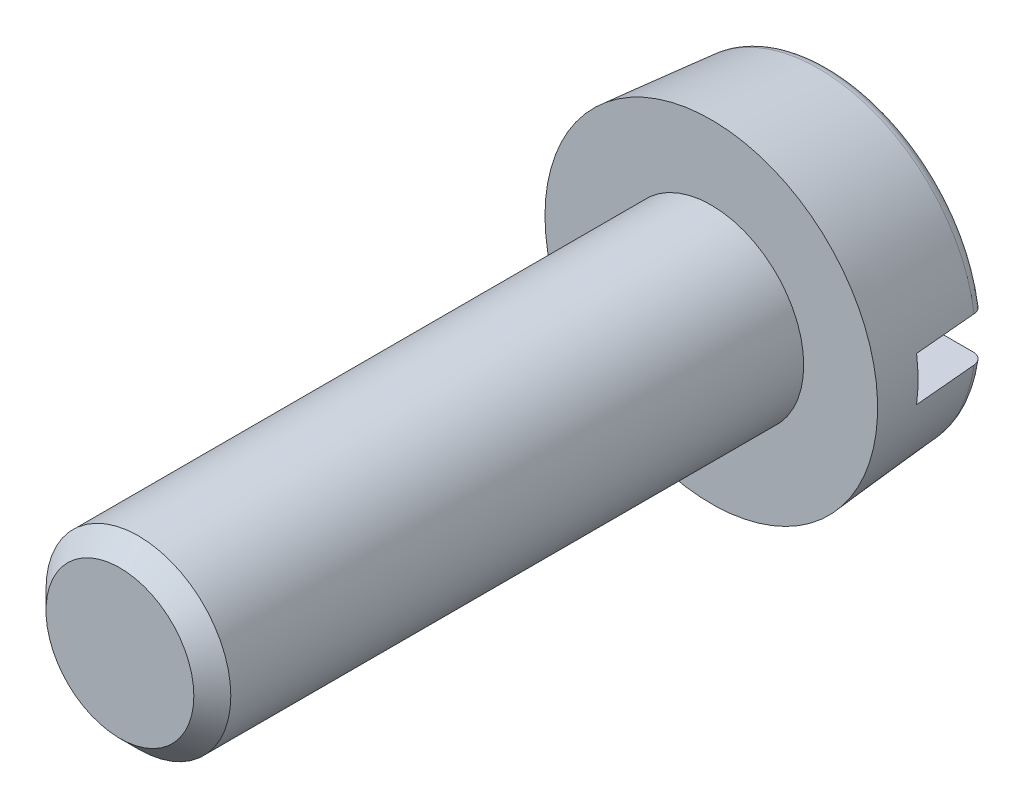
ISO-10303-21;
HEADER;
FILE_DESCRIPTION(('STEP AP214'),'2;1');
FILE_NAME('part.step','',(''),(''),'','','');
FILE_SCHEMA(('AUTOMOTIVE_DESIGN { 1 0 10303 214 1 1 1 1 }'));
ENDSEC;
DATA;
#1=APPLICATION_CONTEXT('core data for automotive mechanical design processes');
#2=APPLICATION_PROTOCOL_DEFINITION('international standard','automotive_design',2000,#1);
#3=PRODUCT_CONTEXT('',#1,'mechanical');
#4=PRODUCT('Part','Part','',(#3));
#5=PRODUCT_RELATED_PRODUCT_CATEGORY('part','',(#4));
#6=PRODUCT_DEFINITION_FORMATION('','',#4);
#7=PRODUCT_DEFINITION_CONTEXT('part definition',#1,'design');
#8=PRODUCT_DEFINITION('design','',#6,#7);
#9=PRODUCT_DEFINITION_SHAPE('','',#8);
#10=(LENGTH_UNIT() NAMED_UNIT(*) SI_UNIT(.MILLI.,.METRE.));
#11=(NAMED_UNIT(*) PLANE_ANGLE_UNIT() SI_UNIT($,.RADIAN.));
#12=(NAMED_UNIT(*) SI_UNIT($,.STERADIAN.) SOLID_ANGLE_UNIT());
#13=UNCERTAINTY_MEASURE_WITH_UNIT(LENGTH_MEASURE(1.E-05),#10,'distance_accuracy_value','');
#14=(GEOMETRIC_REPRESENTATION_CONTEXT(3) GLOBAL_UNCERTAINTY_ASSIGNED_CONTEXT((#13)) GLOBAL_UNIT_ASSIGNED_CONTEXT((#10,
#11,#12)) REPRESENTATION_CONTEXT('',''));
#15=CARTESIAN_POINT('',(0.,0.,0.));
#16=DIRECTION('',(0.,0.,1.));
#17=DIRECTION('',(1.,0.,0.));
#18=AXIS2_PLACEMENT_3D('',#15,#16,#17);
#19=CARTESIAN_POINT('',(0.,0.,-1.59999999999999));
#20=DIRECTION('',(0.,0.,1.));
#21=DIRECTION('',(1.,0.,0.));
#22=AXIS2_PLACEMENT_3D('',#19,#20,#21);
#23=PLANE('',#22);
#24=DIRECTION('',(1.,0.,0.));
#25=VECTOR('',#24,1.);
#26=CARTESIAN_POINT('',(-2.25000000000001,-0.30000000000004,-1.59999999999999));
#27=LINE('',#26,#25);
#28=CARTESIAN_POINT('',(-1.94035042842053,-0.30000000000001,-1.59999999999999));
#29=VERTEX_POINT('',#28);
#30=CARTESIAN_POINT('',(1.94035042842053,-0.300000000000036,-1.59999999999999));
#31=VERTEX_POINT('',#30);
#32=EDGE_CURVE('E206',#29,#31,#27,.T.);
#33=ORIENTED_EDGE('',*,*,#32,.T.);
#34=CARTESIAN_POINT('',(0.,0.,-1.59999999999999));
#35=DIRECTION('',(0.,0.,-1.));
#36=DIRECTION('',(-1.,0.,0.));
#37=AXIS2_PLACEMENT_3D('',#34,#35,#36);
#38=CIRCLE('',#37,1.96340515051573);
#39=EDGE_CURVE('E116',#31,#29,#38,.T.);
#40=ORIENTED_EDGE('',*,*,#39,.T.);
#41=EDGE_LOOP('',(#33,#40));
#42=FACE_BOUND('',#41,.T.);
#43=ADVANCED_FACE('F36',(#42),#23,.F.);
#44=DIRECTION('',(-1.,0.,0.));
#45=VECTOR('',#44,1.);
#46=CARTESIAN_POINT('',(-2.25000000000001,0.299999999999958,-1.59999999999999));
#47=LINE('',#46,#45);
#48=CARTESIAN_POINT('',(1.94035042842053,0.299999999999977,-1.59999999999999));
#49=VERTEX_POINT('',#48);
#50=CARTESIAN_POINT('',(-1.94035042842053,0.299999999999984,-1.59999999999999));
#51=VERTEX_POINT('',#50);
#52=EDGE_CURVE('E101',#49,#51,#47,.T.);
#53=ORIENTED_EDGE('',*,*,#52,.T.);
#54=EDGE_CURVE('E113',#51,#49,#38,.T.);
#55=ORIENTED_EDGE('',*,*,#54,.T.);
#56=EDGE_LOOP('',(#53,#55));
#57=FACE_BOUND('',#56,.T.);
#58=ADVANCED_FACE('F147',(#57),#23,.F.);
#59=CARTESIAN_POINT('',(0.,0.,-1.44));
#60=DIRECTION('',(0.,0.,-1.));
#61=DIRECTION('',(-1.,0.,0.));
#62=AXIS2_PLACEMENT_3D('',#59,#60,#61);
#63=TOROIDAL_SURFACE('',#62,1.96340515051573,0.16);
#64=CARTESIAN_POINT('',(-2.02464929704372,-0.300000000000035,-1.30342454957927));
#65=CARTESIAN_POINT('',(-2.03238938645022,-0.299999999999998,-1.30808813773355));
#66=CARTESIAN_POINT('',(-2.0397302350874,-0.299999999999994,-1.31341159947379));
#67=CARTESIAN_POINT('',(-2.05341968757095,-0.300000000000003,-1.32520564209796));
#68=CARTESIAN_POINT('',(-2.05976863190556,-0.300000000000016,-1.33167582771413));
#69=CARTESIAN_POINT('',(-2.07129025935117,-0.300000000000012,-1.34559915846983));
#70=CARTESIAN_POINT('',(-2.07646208984418,-0.299999999999996,-1.35305300997259));
#71=CARTESIAN_POINT('',(-2.08546893662512,-0.300000000000001,-1.3687256762858));
#72=CARTESIAN_POINT('',(-2.08930440890744,-0.300000000000023,-1.37694422894841));
#73=CARTESIAN_POINT('',(-2.09550224164918,-0.300000000000022,-1.39385316471525));
#74=CARTESIAN_POINT('',(-2.09787484783241,-0.3,-1.40253979183121));
#75=CARTESIAN_POINT('',(-2.10111825783847,-0.299999999999996,-1.42019070905738));
#76=CARTESIAN_POINT('',(-2.10198882599278,-0.300000000000015,-1.42915504251493));
#77=CARTESIAN_POINT('',(-2.10220029511315,-0.300000000000016,-1.44704531451022));
#78=CARTESIAN_POINT('',(-2.10155074064478,-0.3,-1.4559711419653));
#79=CARTESIAN_POINT('',(-2.0987614337047,-0.299999999999997,-1.4735855440648));
#80=CARTESIAN_POINT('',(-2.096621908922,-0.300000000000011,-1.48227415474859));
#81=CARTESIAN_POINT('',(-2.09097610758199,-0.30000000000001,-1.49899459247632));
#82=CARTESIAN_POINT('',(-2.08749896411747,-0.299999999999996,-1.50703627653601));
#83=CARTESIAN_POINT('',(-2.07927587925694,-0.300000000000001,-1.52244264622709));
#84=CARTESIAN_POINT('',(-2.07452984314817,-0.300000000000019,-1.52980728126699));
#85=CARTESIAN_POINT('',(-2.06369301384794,-0.300000000000016,-1.54393623585866));
#86=CARTESIAN_POINT('',(-2.05755692429872,-0.299999999999992,-1.55066585759021));
#87=CARTESIAN_POINT('',(-2.04423921928007,-0.300000000000004,-1.5629961912425));
#88=CARTESIAN_POINT('',(-2.03705748176015,-0.30000000000004,-1.5685967711966));
#89=CARTESIAN_POINT('',(-2.02186128320144,-0.300000000000036,-1.57851380984589));
#90=CARTESIAN_POINT('',(-2.01384719654813,-0.299999999999997,-1.58283084252643));
#91=CARTESIAN_POINT('',(-1.99721237508803,-0.3,-1.59006971709586));
#92=CARTESIAN_POINT('',(-1.98859163746886,-0.300000000000041,-1.59299155251626));
#93=CARTESIAN_POINT('',(-1.97091870079808,-0.300000000000046,-1.5973812130991));
#94=CARTESIAN_POINT('',(-1.96186374376361,-0.300000000000009,-1.59883793441085));
#95=CARTESIAN_POINT('',(-1.9436375590097,-0.299999999999988,-1.60022194772135));
#96=CARTESIAN_POINT('',(-1.93446632582499,-0.300000000000005,-1.60014916756137));
#97=CARTESIAN_POINT('',(-1.91620122580592,-0.300000000000009,-1.598471646742));
#98=CARTESIAN_POINT('',(-1.90710832329842,-0.299999999999997,-1.59685638520298));
#99=CARTESIAN_POINT('',(-1.8893223792299,-0.3,-1.59212246125094));
#100=CARTESIAN_POINT('',(-1.88062934394659,-0.300000000000014,-1.58900377524375));
#101=CARTESIAN_POINT('',(-1.86389238192259,-0.300000000000013,-1.58134698130865));
#102=CARTESIAN_POINT('',(-1.85584844465992,-0.299999999999998,-1.57680889639523));
#103=CARTESIAN_POINT('',(-1.84064450553897,-0.299999999999999,-1.56643653106093));
#104=CARTESIAN_POINT('',(-1.83348447268519,-0.300000000000014,-1.56060229611168));
#105=CARTESIAN_POINT('',(-1.82031484919619,-0.300000000000014,-1.54784998879769));
#106=CARTESIAN_POINT('',(-1.81429660583341,-0.299999999999998,-1.54094085543954));
#107=CARTESIAN_POINT('',(-1.8035234847193,-0.299999999999999,-1.5261990575137));
#108=CARTESIAN_POINT('',(-1.79876852321333,-0.300000000000016,-1.5183664542211));
#109=CARTESIAN_POINT('',(-1.79072202776625,-0.300000000000011,-1.50210751557986));
#110=CARTESIAN_POINT('',(-1.78741252440901,-0.29999999999999,-1.49369007312133));
#111=CARTESIAN_POINT('',(-1.78227224233327,-0.300000000000007,-1.47641541729822));
#112=CARTESIAN_POINT('',(-1.78044132528113,-0.300000000000046,-1.46755824515619));
#113=CARTESIAN_POINT('',(-1.77832801969749,-0.300000000000041,-1.44976395275738));
#114=CARTESIAN_POINT('',(-1.77802818377701,-0.299999999999999,-1.44082890099854));
#115=CARTESIAN_POINT('',(-1.77893920960847,-0.299999999999998,-1.42303579349419));
#116=CARTESIAN_POINT('',(-1.78015011713432,-0.300000000000041,-1.41417774008985));
#117=CARTESIAN_POINT('',(-1.78403768630014,-0.300000000000046,-1.39682461622454));
#118=CARTESIAN_POINT('',(-1.78670884535035,-0.300000000000009,-1.38832831135954));
#119=CARTESIAN_POINT('',(-1.79343111684866,-0.299999999999988,-1.37190233238756));
#120=CARTESIAN_POINT('',(-1.79748202530912,-0.300000000000003,-1.36397257472954));
#121=CARTESIAN_POINT('',(-1.80687028203264,-0.300000000000007,-1.34885198302941));
#122=CARTESIAN_POINT('',(-1.81221491839361,-0.299999999999996,-1.34166567671968));
#123=CARTESIAN_POINT('',(-1.82402289813844,-0.300000000000001,-1.32827601631213));
#124=CARTESIAN_POINT('',(-1.83048664640758,-0.300000000000016,-1.32207301952873));
#125=CARTESIAN_POINT('',(-1.84443082600727,-0.300000000000019,-1.31075125908107));
#126=CARTESIAN_POINT('',(-1.85192245126974,-0.300000000000005,-1.30564629152562));
#127=CARTESIAN_POINT('',(-1.86764748615533,-0.299999999999992,-1.29674140651277));
#128=CARTESIAN_POINT('',(-1.8758811004253,-0.299999999999991,-1.29294185049808));
#129=CARTESIAN_POINT('',(-1.88437618470899,-0.300000000000017,-1.2898595600645));
#130=B_SPLINE_CURVE_WITH_KNOTS('',3,(#64,#65,#66,#67,#68,#69,#70,#71,#72,#73,#74,#75,#76,#77,
#78,#79,#80,#81,#82,#83,#84,#85,#86,#87,#88,#89,#90,#91,#92,#93,#94,#95,#96,#97,#98,#99,#100,
#101,#102,#103,#104,#105,#106,#107,#108,#109,#110,#111,#112,#113,#114,#115,#116,#117,#118,#119,
#120,#121,#122,#123,#124,#125,#126,#127,#128,#129),.UNSPECIFIED.,.F.,.F.,(4,2,2,2,2,2,2,2,2,2,2,
2,2,2,2,2,2,2,2,2,2,2,2,2,2,2,2,2,2,2,2,2,4),(0.,0.0270762320734255,0.0541431492450253,
0.0812296098220387,0.108306818839434,0.135192161848287,0.16208172276172,0.188802902538692,
0.215519999828607,0.241685438135204,0.267852830029475,0.295042618361301,0.32223558289755,
0.349416368746901,0.376597280611857,0.403982673908801,0.431369359194991,0.458944186465299,
0.486519446498425,0.514094259442533,0.5416681051577,0.569023822631126,0.596377725988037,
0.623381161012624,0.650382069355933,0.677074591935086,0.703767923288907,0.730361354042196,
0.756950854822504,0.783693781456511,0.810446403752263,0.837517715120551,0.864596515971967),.UNSPECIFIED.);
#131=CARTESIAN_POINT('',(-2.10149093280898,-0.300000000000021,-1.45394491883963));
#132=VERTEX_POINT('',#131);
#133=EDGE_CURVE('E58',#29,#132,#130,.F.);
#134=ORIENTED_EDGE('',*,*,#133,.F.);
#135=ORIENTED_EDGE('',*,*,#39,.F.);
#136=CARTESIAN_POINT('',(1.87192193792055,-0.30000000000001,-1.29498014059429));
#137=CARTESIAN_POINT('',(1.86365665604565,-0.3,-1.29877602404144));
#138=CARTESIAN_POINT('',(1.85571596083946,-0.3,-1.30327574717215));
#139=CARTESIAN_POINT('',(1.84069618264564,-0.300000000000003,-1.31353396995205));
#140=CARTESIAN_POINT('',(1.83361694392392,-0.300000000000007,-1.319292241553));
#141=CARTESIAN_POINT('',(1.82052442219438,-0.300000000000006,-1.33192491597328));
#142=CARTESIAN_POINT('',(1.81451194952631,-0.300000000000001,-1.33880015974026));
#143=CARTESIAN_POINT('',(1.80374165111526,-0.300000000000002,-1.35346814937426));
#144=CARTESIAN_POINT('',(1.798983340594,-0.300000000000009,-1.361260539042));
#145=CARTESIAN_POINT('',(1.79090415709795,-0.300000000000008,-1.37746698478068));
#146=CARTESIAN_POINT('',(1.78757024385051,-0.3,-1.38587453781138));
#147=CARTESIAN_POINT('',(1.7823790596669,-0.300000000000004,-1.40313569692267));
#148=CARTESIAN_POINT('',(1.78052200113419,-0.300000000000016,-1.41198936696985));
#149=CARTESIAN_POINT('',(1.77835672730874,-0.300000000000015,-1.42978113119124));
#150=CARTESIAN_POINT('',(1.77803106776794,-0.300000000000002,-1.43871710683518));
#151=CARTESIAN_POINT('',(1.77889134237404,-0.300000000000001,-1.45651424290633));
#152=CARTESIAN_POINT('',(1.78007690492273,-0.300000000000012,-1.46537542118642));
#153=CARTESIAN_POINT('',(1.78383153730943,-0.300000000000012,-1.48236382370257));
#154=CARTESIAN_POINT('',(1.78633336881265,-0.300000000000002,-1.4905059956366));
#155=CARTESIAN_POINT('',(1.79260574839287,-0.300000000000001,-1.50628621956971));
#156=CARTESIAN_POINT('',(1.79637639273958,-0.300000000000011,-1.51392423326374));
#157=CARTESIAN_POINT('',(1.80537845098725,-0.300000000000013,-1.52899645668504));
#158=CARTESIAN_POINT('',(1.81069121243361,-0.300000000000003,-1.53638220540862));
#159=CARTESIAN_POINT('',(1.82248536704283,-0.3,-1.5501537958638));
#160=CARTESIAN_POINT('',(1.82896700490272,-0.300000000000007,-1.55653942770313));
#161=CARTESIAN_POINT('',(1.8429031272916,-0.300000000000007,-1.56813246773482));
#162=CARTESIAN_POINT('',(1.85035705242775,-0.299999999999999,-1.57334054874203));
#163=CARTESIAN_POINT('',(1.86602656164542,-0.300000000000004,-1.58244449256944));
#164=CARTESIAN_POINT('',(1.87424213923321,-0.300000000000017,-1.58634036657602));
#165=CARTESIAN_POINT('',(1.89128158778596,-0.300000000000017,-1.59274689308417));
#166=CARTESIAN_POINT('',(1.90011028149796,-0.300000000000003,-1.5952447201112));
#167=CARTESIAN_POINT('',(1.91806064636874,-0.3,-1.59873418389206));
#168=CARTESIAN_POINT('',(1.92718233185473,-0.300000000000011,-1.59972574687522));
#169=CARTESIAN_POINT('',(1.94552672883593,-0.300000000000006,-1.6001767837559));
#170=CARTESIAN_POINT('',(1.95474970336984,-0.299999999999991,-1.59962565417901));
#171=CARTESIAN_POINT('',(1.97297214216613,-0.300000000000012,-1.59698142324873));
#172=CARTESIAN_POINT('',(1.9819716048057,-0.300000000000047,-1.59488831070309));
#173=CARTESIAN_POINT('',(1.99948027791315,-0.300000000000046,-1.58921751799395));
#174=CARTESIAN_POINT('',(2.00798997382085,-0.300000000000009,-1.58564133769318));
#175=CARTESIAN_POINT('',(2.0242816895916,-0.299999999999994,-1.57710047964158));
#176=CARTESIAN_POINT('',(2.03206373577954,-0.300000000000017,-1.5721358521479));
#177=CARTESIAN_POINT('',(2.04661460760603,-0.300000000000021,-1.56099760750979));
#178=CARTESIAN_POINT('',(2.05339068144285,-0.300000000000004,-1.55483346144383));
#179=CARTESIAN_POINT('',(2.06579832392635,-0.299999999999999,-1.54144428767823));
#180=CARTESIAN_POINT('',(2.07142994974375,-0.300000000000011,-1.53421931300321));
#181=CARTESIAN_POINT('',(2.0813263647335,-0.300000000000013,-1.51899455168457));
#182=CARTESIAN_POINT('',(2.08560480767252,-0.300000000000003,-1.51100363992621));
#183=CARTESIAN_POINT('',(2.0927451860902,-0.300000000000001,-1.49441238566327));
#184=CARTESIAN_POINT('',(2.09560722902235,-0.30000000000001,-1.48581208944551));
#185=CARTESIAN_POINT('',(2.09980866249617,-0.300000000000011,-1.46832999311366));
#186=CARTESIAN_POINT('',(2.10116162704749,-0.300000000000003,-1.45945145344438));
#187=CARTESIAN_POINT('',(2.10235053172659,-0.300000000000001,-1.44159288478053));
#188=CARTESIAN_POINT('',(2.10218642032958,-0.300000000000007,-1.43261285234928));
#189=CARTESIAN_POINT('',(2.10035002783136,-0.300000000000006,-1.41484821667873));
#190=CARTESIAN_POINT('',(2.09868432983211,-0.299999999999999,-1.4060629317366));
#191=CARTESIAN_POINT('',(2.09390423755724,-0.300000000000005,-1.388897570698));
#192=CARTESIAN_POINT('',(2.09079009655452,-0.300000000000019,-1.38051742404225));
#193=CARTESIAN_POINT('',(2.08319941144264,-0.300000000000019,-1.36438297790799));
#194=CARTESIAN_POINT('',(2.07872073313043,-0.300000000000003,-1.35662968306703));
#195=CARTESIAN_POINT('',(2.06853281671289,-0.3,-1.34197537615141));
#196=CARTESIAN_POINT('',(2.06282317677678,-0.300000000000012,-1.33507464354404));
#197=CARTESIAN_POINT('',(2.05029523353403,-0.300000000000015,-1.3222742793196));
#198=CARTESIAN_POINT('',(2.04346966339441,-0.300000000000006,-1.31638176571566));
#199=CARTESIAN_POINT('',(2.0289356043396,-0.299999999999997,-1.30580450648123));
#200=CARTESIAN_POINT('',(2.02122679141315,-0.299999999999997,-1.30112020613704));
#201=CARTESIAN_POINT('',(2.0131779179159,-0.300000000000016,-1.29711681792469));
#202=B_SPLINE_CURVE_WITH_KNOTS('',3,(#136,#137,#138,#139,#140,#141,#142,#143,#144,#145,#146,
#147,#148,#149,#150,#151,#152,#153,#154,#155,#156,#157,#158,#159,#160,#161,#162,#163,#164,#165,
#166,#167,#168,#169,#170,#171,#172,#173,#174,#175,#176,#177,#178,#179,#180,#181,#182,#183,#184,
#185,#186,#187,#188,#189,#190,#191,#192,#193,#194,#195,#196,#197,#198,#199,#200,#201),
.UNSPECIFIED.,.F.,.F.,(4,2,2,2,2,2,2,2,2,2,2,2,2,2,2,2,2,2,2,2,2,2,2,2,2,2,2,2,2,2,2,2,4),(0.,
0.0272527077159249,0.0545004813450557,0.0817688652032895,0.109026693352196,0.136029333022942,
0.163035855552001,0.189733987811275,0.216425556465628,0.241869861435967,0.267316097398819,
0.294477965657911,0.321645526700594,0.348797525619947,0.375949293066701,0.403346227007337,
0.430744502694846,0.458331557979555,0.48591881350266,0.513478237134255,0.54103666333552,
0.568385731314877,0.595733432739531,0.622795672250161,0.649855858401689,0.676670627098275,
0.703486306514209,0.730184992077352,0.756879010896381,0.783614996679391,0.81035972331419,
0.83728610491247,0.864222396078811),.UNSPECIFIED.);
#203=CARTESIAN_POINT('',(2.10149093280895,-0.300000000000016,-1.45394491883963));
#204=VERTEX_POINT('',#203);
#205=EDGE_CURVE('E134',#204,#31,#202,.F.);
#206=ORIENTED_EDGE('',*,*,#205,.F.);
#207=CARTESIAN_POINT('',(0.,0.,-1.45394491883963));
#208=DIRECTION('',(0.,0.,-1.));
#209=DIRECTION('',(-1.,0.,0.));
#210=AXIS2_PLACEMENT_3D('',#207,#208,#209);
#211=CIRCLE('',#210,2.12279630221041);
#212=EDGE_CURVE('E125',#204,#132,#211,.T.);
#213=ORIENTED_EDGE('',*,*,#212,.T.);
#214=EDGE_LOOP('',(#134,#135,#206,#213));
#215=FACE_BOUND('',#214,.T.);
#216=ADVANCED_FACE('F142',(#215),#63,.T.);
#217=CARTESIAN_POINT('',(-2.02464929704371,0.299999999999962,-1.30342454957927));
#218=CARTESIAN_POINT('',(-2.03238938645021,0.300000000000003,-1.30808813773355));
#219=CARTESIAN_POINT('',(-2.03973023508739,0.30000000000001,-1.31341159947379));
#220=CARTESIAN_POINT('',(-2.05341968757094,0.300000000000004,-1.32520564209796));
#221=CARTESIAN_POINT('',(-2.05976863190555,0.299999999999991,-1.33167582771413));
#222=CARTESIAN_POINT('',(-2.07129025935116,0.299999999999995,-1.34559915846984));
#223=CARTESIAN_POINT('',(-2.07646208984416,0.300000000000011,-1.3530530099726));
#224=CARTESIAN_POINT('',(-2.08546893662512,0.300000000000003,-1.36872567628581));
#225=CARTESIAN_POINT('',(-2.08930440890744,0.299999999999978,-1.37694422894841));
#226=CARTESIAN_POINT('',(-2.09550224164918,0.29999999999998,-1.39385316471525));
#227=CARTESIAN_POINT('',(-2.0978748478324,0.300000000000006,-1.40253979183121));
#228=CARTESIAN_POINT('',(-2.10111825783846,0.300000000000007,-1.42019070905739));
#229=CARTESIAN_POINT('',(-2.10198882599278,0.299999999999983,-1.42915504251493));
#230=CARTESIAN_POINT('',(-2.10220029511314,0.299999999999982,-1.44704531451022));
#231=CARTESIAN_POINT('',(-2.10155074064477,0.300000000000006,-1.45597114196529));
#232=CARTESIAN_POINT('',(-2.09876143370469,0.300000000000008,-1.4735855440648));
#233=CARTESIAN_POINT('',(-2.096621908922,0.299999999999987,-1.4822741547486));
#234=CARTESIAN_POINT('',(-2.09097610758198,0.299999999999986,-1.49899459247632));
#235=CARTESIAN_POINT('',(-2.08749896411746,0.300000000000005,-1.507036276536));
#236=CARTESIAN_POINT('',(-2.07927587925693,0.300000000000008,-1.52244264622709));
#237=CARTESIAN_POINT('',(-2.07452984314816,0.299999999999992,-1.52980728126699));
#238=CARTESIAN_POINT('',(-2.06369301384793,0.299999999999994,-1.54393623585867));
#239=CARTESIAN_POINT('',(-2.0575569242987,0.300000000000014,-1.55066585759021));
#240=CARTESIAN_POINT('',(-2.04423921928006,0.3,-1.5629961912425));
#241=CARTESIAN_POINT('',(-2.03705748176014,0.299999999999966,-1.5685967711966));
#242=CARTESIAN_POINT('',(-2.02186128320143,0.299999999999971,-1.57851380984589));
#243=CARTESIAN_POINT('',(-2.01384719654812,0.300000000000009,-1.58283084252643));
#244=CARTESIAN_POINT('',(-1.99721237508802,0.300000000000004,-1.59006971709586));
#245=CARTESIAN_POINT('',(-1.98859163746885,0.299999999999962,-1.59299155251626));
#246=CARTESIAN_POINT('',(-1.97091870079807,0.299999999999958,-1.5973812130991));
#247=CARTESIAN_POINT('',(-1.96186374376361,0.299999999999998,-1.59883793441085));
#248=CARTESIAN_POINT('',(-1.9436375590097,0.300000000000016,-1.60022194772135));
#249=CARTESIAN_POINT('',(-1.93446632582499,0.299999999999994,-1.60014916756136));
#250=CARTESIAN_POINT('',(-1.91620122580592,0.299999999999988,-1.598471646742));
#251=CARTESIAN_POINT('',(-1.90710832329842,0.300000000000004,-1.59685638520299));
#252=CARTESIAN_POINT('',(-1.8893223792299,0.300000000000009,-1.59212246125094));
#253=CARTESIAN_POINT('',(-1.8806293439466,0.299999999999998,-1.58900377524372));
#254=CARTESIAN_POINT('',(-1.86389238192259,0.299999999999998,-1.58134698130862));
#255=CARTESIAN_POINT('',(-1.85584844465991,0.300000000000008,-1.57680889639522));
#256=CARTESIAN_POINT('',(-1.84064450553895,0.300000000000005,-1.56643653106094));
#257=CARTESIAN_POINT('',(-1.83348447268519,0.29999999999999,-1.56060229611168));
#258=CARTESIAN_POINT('',(-1.82031484919619,0.299999999999992,-1.54784998879769));
#259=CARTESIAN_POINT('',(-1.81429660583339,0.300000000000009,-1.54094085543955));
#260=CARTESIAN_POINT('',(-1.80352348471929,0.300000000000004,-1.5261990575137));
#261=CARTESIAN_POINT('',(-1.79876852321333,0.299999999999984,-1.5183664542211));
#262=CARTESIAN_POINT('',(-1.79072202776624,0.299999999999988,-1.50210751557986));
#263=CARTESIAN_POINT('',(-1.787412524409,0.300000000000013,-1.49369007312134));
#264=CARTESIAN_POINT('',(-1.78227224233326,0.3,-1.47641541729822));
#265=CARTESIAN_POINT('',(-1.78044132528113,0.299999999999963,-1.46755824515619));
#266=CARTESIAN_POINT('',(-1.77832801969749,0.299999999999967,-1.44976395275738));
#267=CARTESIAN_POINT('',(-1.778028183777,0.300000000000008,-1.44082890099853));
#268=CARTESIAN_POINT('',(-1.77893920960845,0.300000000000005,-1.42303579349419));
#269=CARTESIAN_POINT('',(-1.78015011713431,0.299999999999962,-1.41417774008985));
#270=CARTESIAN_POINT('',(-1.78403768630013,0.299999999999959,-1.39682461622454));
#271=CARTESIAN_POINT('',(-1.78670884535034,0.299999999999999,-1.38832831135953));
#272=CARTESIAN_POINT('',(-1.79343111684865,0.300000000000014,-1.37190233238756));
#273=CARTESIAN_POINT('',(-1.79748202530912,0.29999999999999,-1.36397257472954));
#274=CARTESIAN_POINT('',(-1.80687028203265,0.299999999999986,-1.34885198302941));
#275=CARTESIAN_POINT('',(-1.81221491839361,0.300000000000006,-1.34166567671967));
#276=CARTESIAN_POINT('',(-1.82402289813843,0.300000000000007,-1.32827601631212));
#277=CARTESIAN_POINT('',(-1.83048664640758,0.299999999999987,-1.32207301952873));
#278=CARTESIAN_POINT('',(-1.84443082600727,0.299999999999982,-1.31075125908107));
#279=CARTESIAN_POINT('',(-1.85192245126974,0.299999999999998,-1.30564629152562));
#280=CARTESIAN_POINT('',(-1.86764748615532,0.300000000000015,-1.29674140651276));
#281=CARTESIAN_POINT('',(-1.8758811004253,0.300000000000016,-1.29294185049808));
#282=CARTESIAN_POINT('',(-1.884376184709,0.299999999999983,-1.2898595600645));
#283=B_SPLINE_CURVE_WITH_KNOTS('',3,(#217,#218,#219,#220,#221,#222,#223,#224,#225,#226,#227,
#228,#229,#230,#231,#232,#233,#234,#235,#236,#237,#238,#239,#240,#241,#242,#243,#244,#245,#246,
#247,#248,#249,#250,#251,#252,#253,#254,#255,#256,#257,#258,#259,#260,#261,#262,#263,#264,#265,
#266,#267,#268,#269,#270,#271,#272,#273,#274,#275,#276,#277,#278,#279,#280,#281,#282),
.UNSPECIFIED.,.F.,.F.,(4,2,2,2,2,2,2,2,2,2,2,2,2,2,2,2,2,2,2,2,2,2,2,2,2,2,2,2,2,2,2,2,4),(0.,
0.0270762320734237,0.0541431492450244,0.0812296098220406,0.108306818839437,0.135192161848288,
0.162081722761721,0.188802902538692,0.215519999828607,0.241685438135204,0.267852830029477,
0.295042618361305,0.322235582897553,0.349416368746901,0.376597280611858,0.403982673908797,
0.43136935919498,0.458944186465292,0.486519446498427,0.514094259442532,0.541668105157692,
0.569023822631118,0.596377725988031,0.623381161012618,0.650382069355927,0.677074591935081,
0.703767923288903,0.730361354042194,0.756950854822506,0.783693781456512,0.810446403752262,
0.837517715120551,0.864596515971971),.UNSPECIFIED.);
#284=CARTESIAN_POINT('',(-2.10149093280895,0.299999999999989,-1.45394491883963));
#285=VERTEX_POINT('',#284);
#286=EDGE_CURVE('E159',#285,#51,#283,.T.);
#287=ORIENTED_EDGE('',*,*,#286,.F.);
#288=CARTESIAN_POINT('',(2.10149093280898,0.299999999999986,-1.45394491883963));
#289=VERTEX_POINT('',#288);
#290=EDGE_CURVE('E121',#285,#289,#211,.T.);
#291=ORIENTED_EDGE('',*,*,#290,.T.);
#292=CARTESIAN_POINT('',(1.87192193792055,0.299999999999981,-1.29498014059429));
#293=CARTESIAN_POINT('',(1.86365665604564,0.300000000000006,-1.29877602404143));
#294=CARTESIAN_POINT('',(1.85571596083945,0.300000000000007,-1.30327574717214));
#295=CARTESIAN_POINT('',(1.84069618264564,0.299999999999999,-1.31353396995204));
#296=CARTESIAN_POINT('',(1.83361694392393,0.299999999999989,-1.319292241553));
#297=CARTESIAN_POINT('',(1.82052442219438,0.299999999999993,-1.33192491597328));
#298=CARTESIAN_POINT('',(1.8145119495263,0.300000000000007,-1.33880015974025));
#299=CARTESIAN_POINT('',(1.80374165111525,0.3,-1.35346814937425));
#300=CARTESIAN_POINT('',(1.798983340594,0.29999999999998,-1.361260539042));
#301=CARTESIAN_POINT('',(1.79090415709795,0.299999999999981,-1.37746698478068));
#302=CARTESIAN_POINT('',(1.7875702438505,0.300000000000002,-1.38587453781137));
#303=CARTESIAN_POINT('',(1.78237905966689,0.300000000000005,-1.40313569692267));
#304=CARTESIAN_POINT('',(1.78052200113419,0.299999999999986,-1.41198936696985));
#305=CARTESIAN_POINT('',(1.77835672730874,0.299999999999986,-1.42978113119124));
#306=CARTESIAN_POINT('',(1.77803106776792,0.300000000000003,-1.43871710683517));
#307=CARTESIAN_POINT('',(1.77889134237403,0.300000000000004,-1.45651424290631));
#308=CARTESIAN_POINT('',(1.78007690492273,0.299999999999986,-1.46537542118639));
#309=CARTESIAN_POINT('',(1.78383153730943,0.299999999999986,-1.48236382370254));
#310=CARTESIAN_POINT('',(1.78633336881264,0.300000000000001,-1.49050599563659));
#311=CARTESIAN_POINT('',(1.79260574839286,0.300000000000006,-1.50628621956971));
#312=CARTESIAN_POINT('',(1.79637639273957,0.299999999999997,-1.51392423326374));
#313=CARTESIAN_POINT('',(1.80537845098725,0.299999999999996,-1.52899645668504));
#314=CARTESIAN_POINT('',(1.8106912124336,0.300000000000007,-1.53638220540863));
#315=CARTESIAN_POINT('',(1.82248536704282,0.3,-1.55015379586381));
#316=CARTESIAN_POINT('',(1.82896700490272,0.299999999999984,-1.55653942770313));
#317=CARTESIAN_POINT('',(1.84290312729161,0.299999999999985,-1.56813246773482));
#318=CARTESIAN_POINT('',(1.85035705242775,0.300000000000003,-1.57334054874203));
#319=CARTESIAN_POINT('',(1.86602656164542,0.300000000000004,-1.58244449256945));
#320=CARTESIAN_POINT('',(1.87424213923321,0.299999999999988,-1.58634036657602));
#321=CARTESIAN_POINT('',(1.89128158778596,0.299999999999988,-1.59274689308417));
#322=CARTESIAN_POINT('',(1.90011028149796,0.300000000000004,-1.5952447201112));
#323=CARTESIAN_POINT('',(1.91806064636874,0.300000000000003,-1.59873418389206));
#324=CARTESIAN_POINT('',(1.92718233185473,0.299999999999986,-1.59972574687522));
#325=CARTESIAN_POINT('',(1.94552672883592,0.299999999999989,-1.6001767837559));
#326=CARTESIAN_POINT('',(1.95474970336984,0.30000000000001,-1.59962565417901));
#327=CARTESIAN_POINT('',(1.97297214216613,0.299999999999996,-1.59698142324873));
#328=CARTESIAN_POINT('',(1.9819716048057,0.299999999999962,-1.59488831070309));
#329=CARTESIAN_POINT('',(1.99948027791315,0.299999999999962,-1.58921751799395));
#330=CARTESIAN_POINT('',(2.00798997382085,0.299999999999996,-1.58564133769318));
#331=CARTESIAN_POINT('',(2.0242816895916,0.30000000000001,-1.57710047964157));
#332=CARTESIAN_POINT('',(2.03206373577954,0.29999999999999,-1.5721358521479));
#333=CARTESIAN_POINT('',(2.04661460760603,0.299999999999986,-1.56099760750979));
#334=CARTESIAN_POINT('',(2.05339068144284,0.300000000000002,-1.55483346144382));
#335=CARTESIAN_POINT('',(2.06579832392634,0.300000000000005,-1.54144428767823));
#336=CARTESIAN_POINT('',(2.07142994974375,0.299999999999991,-1.53421931300321));
#337=CARTESIAN_POINT('',(2.0813263647335,0.299999999999991,-1.51899455168457));
#338=CARTESIAN_POINT('',(2.08560480767251,0.300000000000004,-1.5110036399262));
#339=CARTESIAN_POINT('',(2.0927451860902,0.300000000000002,-1.49441238566325));
#340=CARTESIAN_POINT('',(2.09560722902236,0.299999999999987,-1.48581208944549));
#341=CARTESIAN_POINT('',(2.09980866249618,0.299999999999988,-1.46832999311364));
#342=CARTESIAN_POINT('',(2.10116162704748,0.300000000000004,-1.45945145344436));
#343=CARTESIAN_POINT('',(2.10235053172658,0.300000000000003,-1.44159288478051));
#344=CARTESIAN_POINT('',(2.10218642032959,0.299999999999986,-1.43261285234927));
#345=CARTESIAN_POINT('',(2.10035002783136,0.299999999999986,-1.41484821667874));
#346=CARTESIAN_POINT('',(2.0986843298321,0.300000000000003,-1.40606293173661));
#347=CARTESIAN_POINT('',(2.09390423755723,0.300000000000004,-1.388897570698));
#348=CARTESIAN_POINT('',(2.09079009655454,0.299999999999988,-1.38051742404225));
#349=CARTESIAN_POINT('',(2.08319941144266,0.299999999999988,-1.36438297790799));
#350=CARTESIAN_POINT('',(2.07872073313043,0.300000000000003,-1.35662968306704));
#351=CARTESIAN_POINT('',(2.06853281671289,0.300000000000003,-1.34197537615142));
#352=CARTESIAN_POINT('',(2.06282317677678,0.299999999999988,-1.33507464354404));
#353=CARTESIAN_POINT('',(2.05029523353404,0.299999999999984,-1.3222742793196));
#354=CARTESIAN_POINT('',(2.04346966339441,0.299999999999996,-1.31638176571567));
#355=CARTESIAN_POINT('',(2.02893560433959,0.30000000000001,-1.30580450648124));
#356=CARTESIAN_POINT('',(2.02122679141314,0.300000000000011,-1.30112020613705));
#357=CARTESIAN_POINT('',(2.01317791791591,0.299999999999988,-1.29711681792469));
#358=B_SPLINE_CURVE_WITH_KNOTS('',3,(#292,#293,#294,#295,#296,#297,#298,#299,#300,#301,#302,
#303,#304,#305,#306,#307,#308,#309,#310,#311,#312,#313,#314,#315,#316,#317,#318,#319,#320,#321,
#322,#323,#324,#325,#326,#327,#328,#329,#330,#331,#332,#333,#334,#335,#336,#337,#338,#339,#340,
#341,#342,#343,#344,#345,#346,#347,#348,#349,#350,#351,#352,#353,#354,#355,#356,#357),
.UNSPECIFIED.,.F.,.F.,(4,2,2,2,2,2,2,2,2,2,2,2,2,2,2,2,2,2,2,2,2,2,2,2,2,2,2,2,2,2,2,2,4),(0.,
0.0272527077159258,0.0545004813450557,0.0817688652032908,0.109026693352199,0.136029333022948,
0.163035855552008,0.189733987811269,0.216425556465611,0.241869861435963,0.267316097398828,
0.294477965657923,0.32164552670061,0.348797525619961,0.375949293066713,0.403346227007347,
0.430744502694855,0.458331557979567,0.485918813502675,0.513478237134269,0.541036663335533,
0.568385731314888,0.595733432739541,0.622795672250185,0.649855858401728,0.676670627098297,
0.703486306514216,0.730184992077357,0.756879010896384,0.783614996679393,0.810359723314192,
0.837286104912473,0.864222396078814),.UNSPECIFIED.);
#359=EDGE_CURVE('E153',#49,#289,#358,.T.);
#360=ORIENTED_EDGE('',*,*,#359,.F.);
#361=ORIENTED_EDGE('',*,*,#54,.F.);
#362=EDGE_LOOP('',(#287,#291,#360,#361));
#363=FACE_BOUND('',#362,.T.);
#364=ADVANCED_FACE('F146',(#363),#63,.T.);
#365=CARTESIAN_POINT('',(0.,0.,0.));
#366=DIRECTION('',(0.,0.,1.));
#367=DIRECTION('',(1.,0.,0.));
#368=AXIS2_PLACEMENT_3D('',#365,#366,#367);
#369=CONICAL_SURFACE('',#368,2.25,0.087266462599717);
#370=CARTESIAN_POINT('',(0.,0.,0.));
#371=DIRECTION('',(0.,0.,-1.));
#372=DIRECTION('',(-1.,0.,0.));
#373=AXIS2_PLACEMENT_3D('',#370,#371,#372);
#374=CIRCLE('',#373,2.25);
#375=CARTESIAN_POINT('',(-2.25000000000001,0.,0.));
#376=VERTEX_POINT('',#375);
#377=EDGE_CURVE('E126',#376,#376,#374,.T.);
#378=ORIENTED_EDGE('',*,*,#377,.T.);
#379=EDGE_LOOP('',(#378));
#380=FACE_BOUND('',#379,.T.);
#381=CARTESIAN_POINT('',(-1.78588247998707,-0.299999999999995,-5.01888098303502));
#382=CARTESIAN_POINT('',(-1.88400441537212,-0.300000000000077,-3.91273969464957));
#383=CARTESIAN_POINT('',(-1.98192733195555,-0.300000000000054,-2.80658078532441));
#384=CARTESIAN_POINT('',(-2.0983767044157,-0.300000000000012,-1.48920360890639));
#385=CARTESIAN_POINT('',(-2.11704098144521,-0.300000000000005,-1.27799752712028));
#386=CARTESIAN_POINT('',(-2.25208718609907,-0.299999999999955,0.250591681485404));
#387=CARTESIAN_POINT('',(-2.36828622831462,-0.299999999999919,1.56799097134639));
#388=CARTESIAN_POINT('',(-2.48439212316572,-0.300000000000047,2.88539844790844));
#389=B_SPLINE_CURVE_WITH_KNOTS('',3,(#381,#382,#383,#384,#385,#386,#387,#388),.UNSPECIFIED.,.F.,
.F.,(4,2,2,4),(0.,3.33145429979508,3.96754177628165,7.93508351848097),.UNSPECIFIED.);
#390=CARTESIAN_POINT('',(-2.17693273766748,-0.3,-0.600000000000017));
#391=VERTEX_POINT('',#390);
#392=EDGE_CURVE('E86',#132,#391,#389,.T.);
#393=ORIENTED_EDGE('',*,*,#392,.F.);
#394=ORIENTED_EDGE('',*,*,#212,.F.);
#395=CARTESIAN_POINT('',(2.48439212316571,-0.300000000000043,2.88539844790844));
#396=CARTESIAN_POINT('',(2.42634360354495,-0.300000000000021,2.22669430935347));
#397=CARTESIAN_POINT('',(2.36826752395302,-0.300000000000008,1.56799259793448));
#398=CARTESIAN_POINT('',(2.25204278209651,-0.299999999999996,0.250595592449324));
#399=CARTESIAN_POINT('',(2.19389411983341,-0.299999999999995,-0.408099701616978));
#400=CARTESIAN_POINT('',(2.07750674700269,-0.299999999999997,-1.7254823422426));
#401=CARTESIAN_POINT('',(2.01926803643424,-0.3,-2.38416968880184));
#402=CARTESIAN_POINT('',(1.90267168048372,-0.300000000000004,-3.70153386812444));
#403=CARTESIAN_POINT('',(1.8443140350992,-0.300000000000005,-4.36021070088757));
#404=CARTESIAN_POINT('',(1.78588247998706,-0.300000000000005,-5.01888098303502));
#405=B_SPLINE_CURVE_WITH_KNOTS('',3,(#395,#396,#397,#398,#399,#400,#401,#402,#403,#404),
.UNSPECIFIED.,.F.,.F.,(4,2,2,2,4),(0.,1.98377089438244,3.96754174822129,5.95131262013578,
7.93508353293143),.UNSPECIFIED.);
#406=CARTESIAN_POINT('',(2.17693273766748,-0.30000000000001,-0.600000000000017));
#407=VERTEX_POINT('',#406);
#408=EDGE_CURVE('E106',#407,#204,#405,.T.);
#409=ORIENTED_EDGE('',*,*,#408,.F.);
#410=CARTESIAN_POINT('',(0.,0.,-0.599999999999989));
#411=DIRECTION('',(0.,0.,1.));
#412=DIRECTION('',(1.,0.,0.));
#413=AXIS2_PLACEMENT_3D('',#410,#411,#412);
#414=CIRCLE('',#413,2.19750680188445);
#415=CARTESIAN_POINT('',(2.17693273766748,0.299999999999988,-0.599999999999989));
#416=VERTEX_POINT('',#415);
#417=EDGE_CURVE('E100',#407,#416,#414,.T.);
#418=ORIENTED_EDGE('',*,*,#417,.T.);
#419=CARTESIAN_POINT('',(1.78588247998706,0.300000000000002,-5.01888098303502));
#420=CARTESIAN_POINT('',(1.88400441537211,0.299999999999917,-3.91273969464956));
#421=CARTESIAN_POINT('',(1.98192733195554,0.299999999999946,-2.80658078532441));
#422=CARTESIAN_POINT('',(2.0983767044157,0.299999999999996,-1.48920360890639));
#423=CARTESIAN_POINT('',(2.11704098144521,0.300000000000004,-1.27799752712028));
#424=CARTESIAN_POINT('',(2.25208718609908,0.300000000000062,0.250591681485404));
#425=CARTESIAN_POINT('',(2.36828622831463,0.300000000000102,1.5679909713464));
#426=CARTESIAN_POINT('',(2.48439212316571,0.299999999999957,2.88539844790844));
#427=B_SPLINE_CURVE_WITH_KNOTS('',3,(#419,#420,#421,#422,#423,#424,#425,#426),.UNSPECIFIED.,.F.,
.F.,(4,2,2,4),(0.,3.33145429979508,3.96754177628165,7.93508351848097),.UNSPECIFIED.);
#428=EDGE_CURVE('E109',#289,#416,#427,.T.);
#429=ORIENTED_EDGE('',*,*,#428,.F.);
#430=ORIENTED_EDGE('',*,*,#290,.F.);
#431=CARTESIAN_POINT('',(-2.48439212316571,0.29999999999996,2.88539844790844));
#432=CARTESIAN_POINT('',(-2.42634360354495,0.299999999999994,2.22669430935347));
#433=CARTESIAN_POINT('',(-2.36826752395302,0.300000000000005,1.56799259793448));
#434=CARTESIAN_POINT('',(-2.25204278209651,0.300000000000009,0.250595592449323));
#435=CARTESIAN_POINT('',(-2.19389411983341,0.300000000000003,-0.408099701616979));
#436=CARTESIAN_POINT('',(-2.07750674700269,0.3,-1.72548234224259));
#437=CARTESIAN_POINT('',(-2.01926803643424,0.300000000000004,-2.38416968880184));
#438=CARTESIAN_POINT('',(-1.90267168048372,0.300000000000009,-3.70153386812444));
#439=CARTESIAN_POINT('',(-1.8443140350992,0.300000000000009,-4.36021070088758));
#440=CARTESIAN_POINT('',(-1.78588247998707,0.300000000000002,-5.01888098303502));
#441=B_SPLINE_CURVE_WITH_KNOTS('',3,(#431,#432,#433,#434,#435,#436,#437,#438,#439,#440),
.UNSPECIFIED.,.F.,.F.,(4,2,2,2,4),(0.,1.98377089438244,3.96754174822129,5.95131262013578,
7.93508353293143),.UNSPECIFIED.);
#442=CARTESIAN_POINT('',(-2.17693273766748,0.300000000000002,-0.599999999999989));
#443=VERTEX_POINT('',#442);
#444=EDGE_CURVE('E95',#443,#285,#441,.T.);
#445=ORIENTED_EDGE('',*,*,#444,.F.);
#446=EDGE_CURVE('E98',#443,#391,#414,.T.);
#447=ORIENTED_EDGE('',*,*,#446,.T.);
#448=EDGE_LOOP('',(#393,#394,#409,#418,#429,#430,#445,#447));
#449=FACE_BOUND('',#448,.T.);
#450=ADVANCED_FACE('F104',(#380,#449),#369,.T.);
#451=CARTESIAN_POINT('',(0.,0.,0.));
#452=DIRECTION('',(0.,0.,-1.));
#453=DIRECTION('',(-1.,0.,0.));
#454=AXIS2_PLACEMENT_3D('',#451,#452,#453);
#455=PLANE('',#454);
#456=CARTESIAN_POINT('',(0.,0.,0.));
#457=DIRECTION('',(0.,0.,1.));
#458=DIRECTION('',(1.,0.,0.));
#459=AXIS2_PLACEMENT_3D('',#456,#457,#458);
#460=CIRCLE('',#459,1.25);
#461=CARTESIAN_POINT('',(1.25,0.,0.));
#462=VERTEX_POINT('',#461);
#463=EDGE_CURVE('E208',#462,#462,#460,.T.);
#464=ORIENTED_EDGE('',*,*,#463,.F.);
#465=EDGE_LOOP('',(#464));
#466=FACE_BOUND('',#465,.T.);
#467=ORIENTED_EDGE('',*,*,#377,.F.);
#468=EDGE_LOOP('',(#467));
#469=FACE_BOUND('',#468,.T.);
#470=ADVANCED_FACE('F221',(#466,#469),#455,.F.);
#471=CARTESIAN_POINT('',(-2.25,-0.299999999999998,-0.600000000000017));
#472=DIRECTION('',(0.,1.,0.));
#473=DIRECTION('',(0.,0.,1.));
#474=AXIS2_PLACEMENT_3D('',#471,#472,#473);
#475=PLANE('',#474);
#476=ORIENTED_EDGE('',*,*,#133,.T.);
#477=ORIENTED_EDGE('',*,*,#392,.T.);
#478=DIRECTION('',(1.,0.,0.));
#479=VECTOR('',#478,1.);
#480=CARTESIAN_POINT('',(-2.25,-0.299999999999998,-0.600000000000017));
#481=LINE('',#480,#479);
#482=EDGE_CURVE('E89',#391,#407,#481,.T.);
#483=ORIENTED_EDGE('',*,*,#482,.T.);
#484=ORIENTED_EDGE('',*,*,#408,.T.);
#485=ORIENTED_EDGE('',*,*,#205,.T.);
#486=ORIENTED_EDGE('',*,*,#32,.F.);
#487=EDGE_LOOP('',(#476,#477,#483,#484,#485,#486));
#488=FACE_BOUND('',#487,.T.);
#489=ADVANCED_FACE('F88',(#488),#475,.T.);
#490=CARTESIAN_POINT('',(-2.25,0.300000000000007,-0.599999999999989));
#491=DIRECTION('',(0.,-1.,0.));
#492=DIRECTION('',(0.,0.,-1.));
#493=AXIS2_PLACEMENT_3D('',#490,#491,#492);
#494=PLANE('',#493);
#495=ORIENTED_EDGE('',*,*,#286,.T.);
#496=ORIENTED_EDGE('',*,*,#52,.F.);
#497=ORIENTED_EDGE('',*,*,#359,.T.);
#498=ORIENTED_EDGE('',*,*,#428,.T.);
#499=DIRECTION('',(-1.,0.,0.));
#500=VECTOR('',#499,1.);
#501=CARTESIAN_POINT('',(-2.25,0.300000000000007,-0.599999999999989));
#502=LINE('',#501,#500);
#503=EDGE_CURVE('E50',#416,#443,#502,.T.);
#504=ORIENTED_EDGE('',*,*,#503,.T.);
#505=ORIENTED_EDGE('',*,*,#444,.T.);
#506=EDGE_LOOP('',(#495,#496,#497,#498,#504,#505));
#507=FACE_BOUND('',#506,.T.);
#508=ADVANCED_FACE('F163',(#507),#494,.T.);
#509=CARTESIAN_POINT('',(-2.25,-0.299999999999998,-0.600000000000017));
#510=DIRECTION('',(0.,0.,1.));
#511=DIRECTION('',(1.,0.,0.));
#512=AXIS2_PLACEMENT_3D('',#509,#510,#511);
#513=PLANE('',#512);
#514=ORIENTED_EDGE('',*,*,#503,.F.);
#515=ORIENTED_EDGE('',*,*,#417,.F.);
#516=ORIENTED_EDGE('',*,*,#482,.F.);
#517=ORIENTED_EDGE('',*,*,#446,.F.);
#518=EDGE_LOOP('',(#514,#515,#516,#517));
#519=FACE_BOUND('',#518,.T.);
#520=ADVANCED_FACE('F97',(#519),#513,.F.);
#521=CARTESIAN_POINT('',(0.,0.,8.00000000000001));
#522=DIRECTION('',(0.,0.,1.));
#523=DIRECTION('',(1.,0.,0.));
#524=AXIS2_PLACEMENT_3D('',#521,#522,#523);
#525=PLANE('',#524);
#526=CARTESIAN_POINT('',(0.,0.,8.00000000000001));
#527=DIRECTION('',(0.,0.,1.));
#528=DIRECTION('',(1.,0.,0.));
#529=AXIS2_PLACEMENT_3D('',#526,#527,#528);
#530=CIRCLE('',#529,0.999999999999996);
#531=CARTESIAN_POINT('',(1.,0.,8.00000000000001));
#532=VERTEX_POINT('',#531);
#533=EDGE_CURVE('E43',#532,#532,#530,.T.);
#534=ORIENTED_EDGE('',*,*,#533,.T.);
#535=EDGE_LOOP('',(#534));
#536=FACE_BOUND('',#535,.T.);
#537=ADVANCED_FACE('F187',(#536),#525,.T.);
#538=CARTESIAN_POINT('',(0.,0.,0.));
#539=DIRECTION('',(0.,0.,1.));
#540=DIRECTION('',(1.,0.,0.));
#541=AXIS2_PLACEMENT_3D('',#538,#539,#540);
#542=CYLINDRICAL_SURFACE('',#541,1.25);
#543=CARTESIAN_POINT('',(0.,0.,7.75000000000001));
#544=DIRECTION('',(0.,0.,1.));
#545=DIRECTION('',(1.,0.,0.));
#546=AXIS2_PLACEMENT_3D('',#543,#544,#545);
#547=CIRCLE('',#546,1.25);
#548=CARTESIAN_POINT('',(1.25,0.,7.75000000000001));
#549=VERTEX_POINT('',#548);
#550=EDGE_CURVE('E11',#549,#549,#547,.F.);
#551=ORIENTED_EDGE('',*,*,#550,.T.);
#552=EDGE_LOOP('',(#551));
#553=FACE_BOUND('',#552,.T.);
#554=ORIENTED_EDGE('',*,*,#463,.T.);
#555=EDGE_LOOP('',(#554));
#556=FACE_BOUND('',#555,.T.);
#557=ADVANCED_FACE('F191',(#553,#556),#542,.T.);
#558=CARTESIAN_POINT('',(0.,0.,8.00000000000001));
#559=DIRECTION('',(0.,0.,-1.));
#560=DIRECTION('',(-1.,0.,0.));
#561=AXIS2_PLACEMENT_3D('',#558,#559,#560);
#562=CONICAL_SURFACE('',#561,0.999999999999996,0.785398163397453);
#563=ORIENTED_EDGE('',*,*,#550,.F.);
#564=EDGE_LOOP('',(#563));
#565=FACE_BOUND('',#564,.T.);
#566=ORIENTED_EDGE('',*,*,#533,.F.);
#567=EDGE_LOOP('',(#566));
#568=FACE_BOUND('',#567,.T.);
#569=ADVANCED_FACE('F189',(#565,#568),#562,.T.);
#570=CLOSED_SHELL('',(#43,#58,#216,#364,#450,#470,#489,#508,#520,#537,#557,#569));
#571=MANIFOLD_SOLID_BREP('B2',#570);
#572=ADVANCED_BREP_SHAPE_REPRESENTATION('',(#18,#571),#14);
#573=SHAPE_DEFINITION_REPRESENTATION(#9,#572);
ENDSEC;
END-ISO-10303-21;
